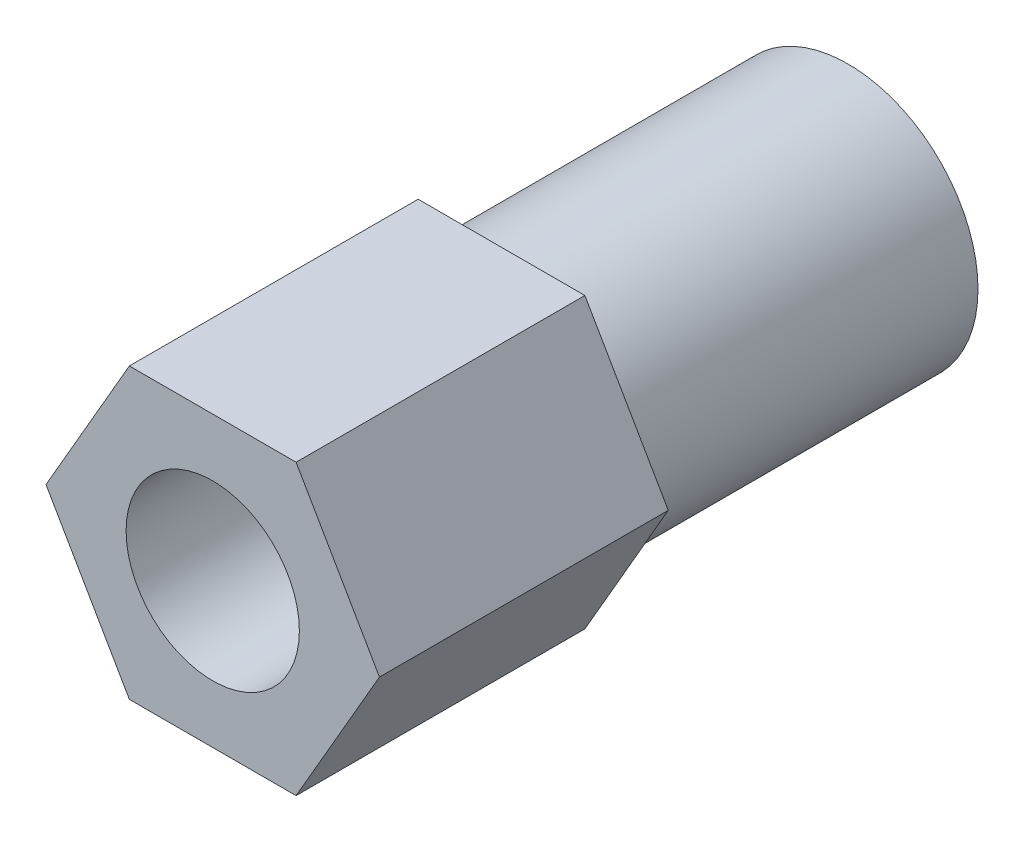
ISO-10303-21;
HEADER;
FILE_DESCRIPTION(('STEP AP214'),'2;1');
FILE_NAME('part.step','',(''),(''),'','','');
FILE_SCHEMA(('AUTOMOTIVE_DESIGN { 1 0 10303 214 1 1 1 1 }'));
ENDSEC;
DATA;
#1=APPLICATION_CONTEXT('core data for automotive mechanical design processes');
#2=APPLICATION_PROTOCOL_DEFINITION('international standard','automotive_design',2000,#1);
#3=PRODUCT_CONTEXT('',#1,'mechanical');
#4=PRODUCT('Part','Part','',(#3));
#5=PRODUCT_RELATED_PRODUCT_CATEGORY('part','',(#4));
#6=PRODUCT_DEFINITION_FORMATION('','',#4);
#7=PRODUCT_DEFINITION_CONTEXT('part definition',#1,'design');
#8=PRODUCT_DEFINITION('design','',#6,#7);
#9=PRODUCT_DEFINITION_SHAPE('','',#8);
#10=(LENGTH_UNIT() NAMED_UNIT(*) SI_UNIT(.MILLI.,.METRE.));
#11=(NAMED_UNIT(*) PLANE_ANGLE_UNIT() SI_UNIT($,.RADIAN.));
#12=(NAMED_UNIT(*) SI_UNIT($,.STERADIAN.) SOLID_ANGLE_UNIT());
#13=UNCERTAINTY_MEASURE_WITH_UNIT(LENGTH_MEASURE(1.E-05),#10,'distance_accuracy_value','');
#14=(GEOMETRIC_REPRESENTATION_CONTEXT(3) GLOBAL_UNCERTAINTY_ASSIGNED_CONTEXT((#13)) GLOBAL_UNIT_ASSIGNED_CONTEXT((#10,
#11,#12)) REPRESENTATION_CONTEXT('',''));
#15=CARTESIAN_POINT('',(0.,0.,0.));
#16=DIRECTION('',(0.,0.,1.));
#17=DIRECTION('',(1.,0.,0.));
#18=AXIS2_PLACEMENT_3D('',#15,#16,#17);
#19=CARTESIAN_POINT('',(0.,0.,0.));
#20=DIRECTION('',(0.,0.,1.));
#21=DIRECTION('',(1.,0.,0.));
#22=AXIS2_PLACEMENT_3D('',#19,#20,#21);
#23=PLANE('',#22);
#24=DIRECTION('',(-0.5,-0.866025403784439,0.));
#25=VECTOR('',#24,1.);
#26=CARTESIAN_POINT('',(-1.44337567297406,2.5,0.));
#27=LINE('',#26,#25);
#28=CARTESIAN_POINT('',(-1.44337567297406,2.5,0.));
#29=VERTEX_POINT('',#28);
#30=CARTESIAN_POINT('',(-2.88675134594813,0.,0.));
#31=VERTEX_POINT('',#30);
#32=EDGE_CURVE('E122',#29,#31,#27,.T.);
#33=ORIENTED_EDGE('',*,*,#32,.F.);
#34=DIRECTION('',(-1.,0.,0.));
#35=VECTOR('',#34,1.);
#36=CARTESIAN_POINT('',(1.44337567297407,2.5,0.));
#37=LINE('',#36,#35);
#38=CARTESIAN_POINT('',(1.44337567297407,2.5,0.));
#39=VERTEX_POINT('',#38);
#40=EDGE_CURVE('E81',#39,#29,#37,.T.);
#41=ORIENTED_EDGE('',*,*,#40,.F.);
#42=DIRECTION('',(-0.5,0.866025403784439,0.));
#43=VECTOR('',#42,1.);
#44=CARTESIAN_POINT('',(2.88675134594813,0.,0.));
#45=LINE('',#44,#43);
#46=CARTESIAN_POINT('',(2.88675134594813,0.,0.));
#47=VERTEX_POINT('',#46);
#48=EDGE_CURVE('E75',#47,#39,#45,.T.);
#49=ORIENTED_EDGE('',*,*,#48,.F.);
#50=DIRECTION('',(0.5,0.866025403784439,0.));
#51=VECTOR('',#50,1.);
#52=CARTESIAN_POINT('',(1.44337567297406,-2.5,0.));
#53=LINE('',#52,#51);
#54=CARTESIAN_POINT('',(1.44337567297406,-2.5,0.));
#55=VERTEX_POINT('',#54);
#56=EDGE_CURVE('E112',#55,#47,#53,.T.);
#57=ORIENTED_EDGE('',*,*,#56,.F.);
#58=DIRECTION('',(1.,0.,0.));
#59=VECTOR('',#58,1.);
#60=CARTESIAN_POINT('',(-1.44337567297407,-2.5,0.));
#61=LINE('',#60,#59);
#62=CARTESIAN_POINT('',(-1.44337567297407,-2.5,0.));
#63=VERTEX_POINT('',#62);
#64=EDGE_CURVE('E128',#63,#55,#61,.T.);
#65=ORIENTED_EDGE('',*,*,#64,.F.);
#66=DIRECTION('',(0.5,-0.866025403784439,0.));
#67=VECTOR('',#66,1.);
#68=CARTESIAN_POINT('',(-2.88675134594813,0.,0.));
#69=LINE('',#68,#67);
#70=EDGE_CURVE('E125',#31,#63,#69,.T.);
#71=ORIENTED_EDGE('',*,*,#70,.F.);
#72=EDGE_LOOP('',(#33,#41,#49,#57,#65,#71));
#73=FACE_BOUND('',#72,.T.);
#74=CARTESIAN_POINT('',(0.,0.,0.));
#75=DIRECTION('',(0.,0.,1.));
#76=DIRECTION('',(1.,0.,0.));
#77=AXIS2_PLACEMENT_3D('',#74,#75,#76);
#78=CIRCLE('',#77,2.25);
#79=CARTESIAN_POINT('',(2.25,0.,0.));
#80=VERTEX_POINT('',#79);
#81=EDGE_CURVE('E11',#80,#80,#78,.F.);
#82=ORIENTED_EDGE('',*,*,#81,.F.);
#83=EDGE_LOOP('',(#82));
#84=FACE_BOUND('',#83,.T.);
#85=ADVANCED_FACE('F35',(#73,#84),#23,.F.);
#86=CARTESIAN_POINT('',(0.,0.,5.));
#87=DIRECTION('',(0.,0.,1.));
#88=DIRECTION('',(1.,0.,0.));
#89=AXIS2_PLACEMENT_3D('',#86,#87,#88);
#90=PLANE('',#89);
#91=DIRECTION('',(-0.5,-0.866025403784439,0.));
#92=VECTOR('',#91,1.);
#93=CARTESIAN_POINT('',(-1.44337567297406,2.5,5.));
#94=LINE('',#93,#92);
#95=CARTESIAN_POINT('',(-1.44337567297406,2.5,5.));
#96=VERTEX_POINT('',#95);
#97=CARTESIAN_POINT('',(-2.88675134594813,0.,5.));
#98=VERTEX_POINT('',#97);
#99=EDGE_CURVE('E133',#96,#98,#94,.T.);
#100=ORIENTED_EDGE('',*,*,#99,.T.);
#101=DIRECTION('',(0.5,-0.866025403784439,0.));
#102=VECTOR('',#101,1.);
#103=CARTESIAN_POINT('',(-2.88675134594813,0.,5.));
#104=LINE('',#103,#102);
#105=CARTESIAN_POINT('',(-1.44337567297407,-2.5,5.));
#106=VERTEX_POINT('',#105);
#107=EDGE_CURVE('E90',#98,#106,#104,.T.);
#108=ORIENTED_EDGE('',*,*,#107,.T.);
#109=DIRECTION('',(1.,0.,0.));
#110=VECTOR('',#109,1.);
#111=CARTESIAN_POINT('',(-1.44337567297407,-2.5,5.));
#112=LINE('',#111,#110);
#113=CARTESIAN_POINT('',(1.44337567297406,-2.5,5.));
#114=VERTEX_POINT('',#113);
#115=EDGE_CURVE('E104',#106,#114,#112,.T.);
#116=ORIENTED_EDGE('',*,*,#115,.T.);
#117=DIRECTION('',(0.5,0.866025403784439,0.));
#118=VECTOR('',#117,1.);
#119=CARTESIAN_POINT('',(1.44337567297406,-2.5,5.));
#120=LINE('',#119,#118);
#121=CARTESIAN_POINT('',(2.88675134594813,0.,5.));
#122=VERTEX_POINT('',#121);
#123=EDGE_CURVE('E97',#114,#122,#120,.T.);
#124=ORIENTED_EDGE('',*,*,#123,.T.);
#125=DIRECTION('',(-0.5,0.866025403784439,0.));
#126=VECTOR('',#125,1.);
#127=CARTESIAN_POINT('',(2.88675134594813,0.,5.));
#128=LINE('',#127,#126);
#129=CARTESIAN_POINT('',(1.44337567297407,2.5,5.));
#130=VERTEX_POINT('',#129);
#131=EDGE_CURVE('E102',#122,#130,#128,.T.);
#132=ORIENTED_EDGE('',*,*,#131,.T.);
#133=DIRECTION('',(-1.,0.,0.));
#134=VECTOR('',#133,1.);
#135=CARTESIAN_POINT('',(1.44337567297407,2.5,5.));
#136=LINE('',#135,#134);
#137=EDGE_CURVE('E52',#130,#96,#136,.T.);
#138=ORIENTED_EDGE('',*,*,#137,.T.);
#139=EDGE_LOOP('',(#100,#108,#116,#124,#132,#138));
#140=FACE_BOUND('',#139,.T.);
#141=CARTESIAN_POINT('',(0.,0.,5.));
#142=DIRECTION('',(0.,0.,1.));
#143=DIRECTION('',(1.,0.,0.));
#144=AXIS2_PLACEMENT_3D('',#141,#142,#143);
#145=CIRCLE('',#144,1.5);
#146=CARTESIAN_POINT('',(1.5,0.,5.));
#147=VERTEX_POINT('',#146);
#148=EDGE_CURVE('E126',#147,#147,#145,.T.);
#149=ORIENTED_EDGE('',*,*,#148,.F.);
#150=EDGE_LOOP('',(#149));
#151=FACE_BOUND('',#150,.T.);
#152=ADVANCED_FACE('F99',(#140,#151),#90,.T.);
#153=CARTESIAN_POINT('',(-1.44337567297406,2.5,5.));
#154=DIRECTION('',(0.866025403784438,-0.5,0.));
#155=DIRECTION('',(0.5,0.866025403784439,0.));
#156=AXIS2_PLACEMENT_3D('',#153,#154,#155);
#157=PLANE('',#156);
#158=ORIENTED_EDGE('',*,*,#32,.T.);
#159=DIRECTION('',(0.,0.,-1.));
#160=VECTOR('',#159,1.);
#161=CARTESIAN_POINT('',(-2.88675134594813,0.,5.));
#162=LINE('',#161,#160);
#163=EDGE_CURVE('E44',#98,#31,#162,.T.);
#164=ORIENTED_EDGE('',*,*,#163,.F.);
#165=ORIENTED_EDGE('',*,*,#99,.F.);
#166=DIRECTION('',(0.,0.,-1.));
#167=VECTOR('',#166,1.);
#168=CARTESIAN_POINT('',(-1.44337567297406,2.5,5.));
#169=LINE('',#168,#167);
#170=EDGE_CURVE('E118',#96,#29,#169,.T.);
#171=ORIENTED_EDGE('',*,*,#170,.T.);
#172=EDGE_LOOP('',(#158,#164,#165,#171));
#173=FACE_BOUND('',#172,.T.);
#174=ADVANCED_FACE('F37',(#173),#157,.F.);
#175=CARTESIAN_POINT('',(-2.88675134594813,0.,5.));
#176=DIRECTION('',(0.866025403784439,0.5,0.));
#177=DIRECTION('',(-0.5,0.866025403784439,0.));
#178=AXIS2_PLACEMENT_3D('',#175,#176,#177);
#179=PLANE('',#178);
#180=ORIENTED_EDGE('',*,*,#70,.T.);
#181=DIRECTION('',(0.,0.,-1.));
#182=VECTOR('',#181,1.);
#183=CARTESIAN_POINT('',(-1.44337567297407,-2.5,5.));
#184=LINE('',#183,#182);
#185=EDGE_CURVE('E137',#106,#63,#184,.T.);
#186=ORIENTED_EDGE('',*,*,#185,.F.);
#187=ORIENTED_EDGE('',*,*,#107,.F.);
#188=ORIENTED_EDGE('',*,*,#163,.T.);
#189=EDGE_LOOP('',(#180,#186,#187,#188));
#190=FACE_BOUND('',#189,.T.);
#191=ADVANCED_FACE('F140',(#190),#179,.F.);
#192=CARTESIAN_POINT('',(-1.44337567297407,-2.5,5.));
#193=DIRECTION('',(0.,1.,0.));
#194=DIRECTION('',(-1.,0.,0.));
#195=AXIS2_PLACEMENT_3D('',#192,#193,#194);
#196=PLANE('',#195);
#197=ORIENTED_EDGE('',*,*,#64,.T.);
#198=DIRECTION('',(0.,0.,-1.));
#199=VECTOR('',#198,1.);
#200=CARTESIAN_POINT('',(1.44337567297406,-2.5,5.));
#201=LINE('',#200,#199);
#202=EDGE_CURVE('E113',#114,#55,#201,.T.);
#203=ORIENTED_EDGE('',*,*,#202,.F.);
#204=ORIENTED_EDGE('',*,*,#115,.F.);
#205=ORIENTED_EDGE('',*,*,#185,.T.);
#206=EDGE_LOOP('',(#197,#203,#204,#205));
#207=FACE_BOUND('',#206,.T.);
#208=ADVANCED_FACE('F148',(#207),#196,.F.);
#209=CARTESIAN_POINT('',(1.44337567297406,-2.5,5.));
#210=DIRECTION('',(-0.866025403784439,0.5,0.));
#211=DIRECTION('',(-0.5,-0.866025403784439,0.));
#212=AXIS2_PLACEMENT_3D('',#209,#210,#211);
#213=PLANE('',#212);
#214=ORIENTED_EDGE('',*,*,#56,.T.);
#215=DIRECTION('',(0.,0.,-1.));
#216=VECTOR('',#215,1.);
#217=CARTESIAN_POINT('',(2.88675134594813,0.,5.));
#218=LINE('',#217,#216);
#219=EDGE_CURVE('E109',#122,#47,#218,.T.);
#220=ORIENTED_EDGE('',*,*,#219,.F.);
#221=ORIENTED_EDGE('',*,*,#123,.F.);
#222=ORIENTED_EDGE('',*,*,#202,.T.);
#223=EDGE_LOOP('',(#214,#220,#221,#222));
#224=FACE_BOUND('',#223,.T.);
#225=ADVANCED_FACE('F110',(#224),#213,.F.);
#226=CARTESIAN_POINT('',(2.88675134594813,0.,5.));
#227=DIRECTION('',(-0.866025403784439,-0.5,0.));
#228=DIRECTION('',(0.5,-0.866025403784439,0.));
#229=AXIS2_PLACEMENT_3D('',#226,#227,#228);
#230=PLANE('',#229);
#231=ORIENTED_EDGE('',*,*,#48,.T.);
#232=DIRECTION('',(0.,0.,-1.));
#233=VECTOR('',#232,1.);
#234=CARTESIAN_POINT('',(1.44337567297407,2.5,5.));
#235=LINE('',#234,#233);
#236=EDGE_CURVE('E114',#130,#39,#235,.T.);
#237=ORIENTED_EDGE('',*,*,#236,.F.);
#238=ORIENTED_EDGE('',*,*,#131,.F.);
#239=ORIENTED_EDGE('',*,*,#219,.T.);
#240=EDGE_LOOP('',(#231,#237,#238,#239));
#241=FACE_BOUND('',#240,.T.);
#242=ADVANCED_FACE('F116',(#241),#230,.F.);
#243=CARTESIAN_POINT('',(1.44337567297407,2.5,5.));
#244=DIRECTION('',(0.,-1.,0.));
#245=DIRECTION('',(0.,0.,-1.));
#246=AXIS2_PLACEMENT_3D('',#243,#244,#245);
#247=PLANE('',#246);
#248=ORIENTED_EDGE('',*,*,#40,.T.);
#249=ORIENTED_EDGE('',*,*,#170,.F.);
#250=ORIENTED_EDGE('',*,*,#137,.F.);
#251=ORIENTED_EDGE('',*,*,#236,.T.);
#252=EDGE_LOOP('',(#248,#249,#250,#251));
#253=FACE_BOUND('',#252,.T.);
#254=ADVANCED_FACE('F174',(#253),#247,.F.);
#255=CARTESIAN_POINT('',(0.,0.,5.));
#256=DIRECTION('',(0.,0.,-1.));
#257=DIRECTION('',(-1.,0.,0.));
#258=AXIS2_PLACEMENT_3D('',#255,#256,#257);
#259=CYLINDRICAL_SURFACE('',#258,1.5);
#260=ORIENTED_EDGE('',*,*,#148,.T.);
#261=EDGE_LOOP('',(#260));
#262=FACE_BOUND('',#261,.T.);
#263=CARTESIAN_POINT('',(0.,0.,-6.));
#264=DIRECTION('',(0.,0.,-1.));
#265=DIRECTION('',(-1.,0.,0.));
#266=AXIS2_PLACEMENT_3D('',#263,#264,#265);
#267=CIRCLE('',#266,1.5);
#268=CARTESIAN_POINT('',(-1.5,0.,-6.));
#269=VERTEX_POINT('',#268);
#270=EDGE_CURVE('E157',#269,#269,#267,.T.);
#271=ORIENTED_EDGE('',*,*,#270,.T.);
#272=EDGE_LOOP('',(#271));
#273=FACE_BOUND('',#272,.T.);
#274=ADVANCED_FACE('F161',(#262,#273),#259,.F.);
#275=CARTESIAN_POINT('',(0.,0.,-6.));
#276=DIRECTION('',(0.,0.,-1.));
#277=DIRECTION('',(-1.,0.,0.));
#278=AXIS2_PLACEMENT_3D('',#275,#276,#277);
#279=PLANE('',#278);
#280=CARTESIAN_POINT('',(0.,0.,-6.));
#281=DIRECTION('',(0.,0.,-1.));
#282=DIRECTION('',(-1.,0.,0.));
#283=AXIS2_PLACEMENT_3D('',#280,#281,#282);
#284=CIRCLE('',#283,2.25);
#285=CARTESIAN_POINT('',(-2.25,0.,-6.));
#286=VERTEX_POINT('',#285);
#287=EDGE_CURVE('E154',#286,#286,#284,.T.);
#288=ORIENTED_EDGE('',*,*,#287,.T.);
#289=EDGE_LOOP('',(#288));
#290=FACE_BOUND('',#289,.T.);
#291=ORIENTED_EDGE('',*,*,#270,.F.);
#292=EDGE_LOOP('',(#291));
#293=FACE_BOUND('',#292,.T.);
#294=ADVANCED_FACE('F163',(#290,#293),#279,.T.);
#295=CARTESIAN_POINT('',(0.,0.,-6.));
#296=DIRECTION('',(0.,0.,1.));
#297=DIRECTION('',(1.,0.,0.));
#298=AXIS2_PLACEMENT_3D('',#295,#296,#297);
#299=CYLINDRICAL_SURFACE('',#298,2.25);
#300=ORIENTED_EDGE('',*,*,#287,.F.);
#301=EDGE_LOOP('',(#300));
#302=FACE_BOUND('',#301,.T.);
#303=ORIENTED_EDGE('',*,*,#81,.T.);
#304=EDGE_LOOP('',(#303));
#305=FACE_BOUND('',#304,.T.);
#306=ADVANCED_FACE('F165',(#302,#305),#299,.T.);
#307=CLOSED_SHELL('',(#85,#152,#174,#191,#208,#225,#242,#254,#274,#294,#306));
#308=MANIFOLD_SOLID_BREP('B2',#307);
#309=ADVANCED_BREP_SHAPE_REPRESENTATION('',(#18,#308),#14);
#310=SHAPE_DEFINITION_REPRESENTATION(#9,#309);
ENDSEC;
END-ISO-10303-21;
